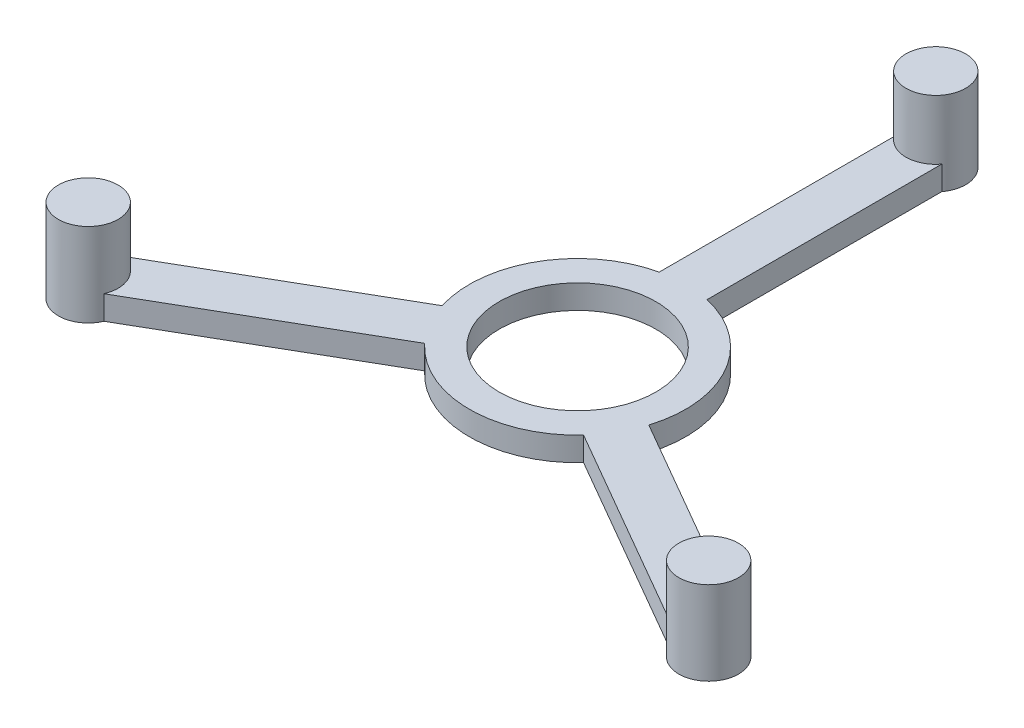
ISO-10303-21;
HEADER;
FILE_DESCRIPTION(('STEP AP214'),'2;1');
FILE_NAME('part.step','',(''),(''),'','','');
FILE_SCHEMA(('AUTOMOTIVE_DESIGN { 1 0 10303 214 1 1 1 1 }'));
ENDSEC;
DATA;
#1=APPLICATION_CONTEXT('core data for automotive mechanical design processes');
#2=APPLICATION_PROTOCOL_DEFINITION('international standard','automotive_design',2000,#1);
#3=PRODUCT_CONTEXT('',#1,'mechanical');
#4=PRODUCT('Part','Part','',(#3));
#5=PRODUCT_RELATED_PRODUCT_CATEGORY('part','',(#4));
#6=PRODUCT_DEFINITION_FORMATION('','',#4);
#7=PRODUCT_DEFINITION_CONTEXT('part definition',#1,'design');
#8=PRODUCT_DEFINITION('design','',#6,#7);
#9=PRODUCT_DEFINITION_SHAPE('','',#8);
#10=(LENGTH_UNIT() NAMED_UNIT(*) SI_UNIT(.MILLI.,.METRE.));
#11=(NAMED_UNIT(*) PLANE_ANGLE_UNIT() SI_UNIT($,.RADIAN.));
#12=(NAMED_UNIT(*) SI_UNIT($,.STERADIAN.) SOLID_ANGLE_UNIT());
#13=UNCERTAINTY_MEASURE_WITH_UNIT(LENGTH_MEASURE(1.E-05),#10,'distance_accuracy_value','');
#14=(GEOMETRIC_REPRESENTATION_CONTEXT(3) GLOBAL_UNCERTAINTY_ASSIGNED_CONTEXT((#13)) GLOBAL_UNIT_ASSIGNED_CONTEXT((#10,
#11,#12)) REPRESENTATION_CONTEXT('',''));
#15=CARTESIAN_POINT('',(0.,0.,0.));
#16=DIRECTION('',(0.,0.,1.));
#17=DIRECTION('',(1.,0.,0.));
#18=AXIS2_PLACEMENT_3D('',#15,#16,#17);
#19=CARTESIAN_POINT('',(0.,2.54,0.));
#20=DIRECTION('',(0.,1.,0.));
#21=DIRECTION('',(0.,0.,1.));
#22=AXIS2_PLACEMENT_3D('',#19,#20,#21);
#23=PLANE('',#22);
#24=CARTESIAN_POINT('',(0.,2.54,0.));
#25=DIRECTION('',(0.,1.,0.));
#26=DIRECTION('',(0.,0.,1.));
#27=AXIS2_PLACEMENT_3D('',#24,#25,#26);
#28=CIRCLE('',#27,8.334375);
#29=CARTESIAN_POINT('',(0.,2.54,8.334375));
#30=VERTEX_POINT('',#29);
#31=EDGE_CURVE('E193',#30,#30,#28,.T.);
#32=ORIENTED_EDGE('',*,*,#31,.F.);
#33=EDGE_LOOP('',(#32));
#34=FACE_BOUND('',#33,.T.);
#35=DIRECTION('',(0.866025403784443,0.,0.499999999999992));
#36=VECTOR('',#35,1.);
#37=CARTESIAN_POINT('',(8.45165544894336,2.54,7.81250491602859));
#38=LINE('',#37,#36);
#39=CARTESIAN_POINT('',(8.45165544894336,2.54,7.81250491602859));
#40=VERTEX_POINT('',#39);
#41=CARTESIAN_POINT('',(30.0757894899779,2.54,20.2972045256122));
#42=VERTEX_POINT('',#41);
#43=EDGE_CURVE('E134',#40,#42,#38,.T.);
#44=ORIENTED_EDGE('',*,*,#43,.T.);
#45=CARTESIAN_POINT('',(32.9955678841873,2.54,19.0499999999997));
#46=DIRECTION('',(0.,1.,0.));
#47=DIRECTION('',(-0.866025403784443,0.,-0.499999999999992));
#48=AXIS2_PLACEMENT_3D('',#45,#46,#47);
#49=CIRCLE('',#48,3.175);
#50=CARTESIAN_POINT('',(32.6157894899779,2.54,15.8977954743872));
#51=VERTEX_POINT('',#50);
#52=EDGE_CURVE('E141',#51,#42,#49,.T.);
#53=ORIENTED_EDGE('',*,*,#52,.F.);
#54=DIRECTION('',(-0.866025403784443,0.,-0.499999999999992));
#55=VECTOR('',#54,1.);
#56=CARTESIAN_POINT('',(10.9916554489433,2.54,3.41309586480362));
#57=LINE('',#56,#55);
#58=CARTESIAN_POINT('',(10.9916554489433,2.54,3.41309586480362));
#59=VERTEX_POINT('',#58);
#60=EDGE_CURVE('E125',#51,#59,#57,.T.);
#61=ORIENTED_EDGE('',*,*,#60,.T.);
#62=CARTESIAN_POINT('',(0.,2.54,0.));
#63=DIRECTION('',(0.,1.,0.));
#64=DIRECTION('',(0.,0.,1.));
#65=AXIS2_PLACEMENT_3D('',#62,#63,#64);
#66=CIRCLE('',#65,11.509375);
#67=CARTESIAN_POINT('',(2.54,2.54,-11.2256007808324));
#68=VERTEX_POINT('',#67);
#69=EDGE_CURVE('E203',#59,#68,#66,.T.);
#70=ORIENTED_EDGE('',*,*,#69,.T.);
#71=DIRECTION('',(0.,0.,-1.));
#72=VECTOR('',#71,1.);
#73=CARTESIAN_POINT('',(2.54,2.54,-11.2256007808324));
#74=LINE('',#73,#72);
#75=CARTESIAN_POINT('',(2.54,2.54,-36.195));
#76=VERTEX_POINT('',#75);
#77=EDGE_CURVE('E201',#68,#76,#74,.T.);
#78=ORIENTED_EDGE('',*,*,#77,.T.);
#79=CARTESIAN_POINT('',(0.,2.54,-38.1));
#80=DIRECTION('',(0.,1.,0.));
#81=DIRECTION('',(0.,0.,1.));
#82=AXIS2_PLACEMENT_3D('',#79,#80,#81);
#83=CIRCLE('',#82,3.175);
#84=CARTESIAN_POINT('',(-2.54,2.54,-36.195));
#85=VERTEX_POINT('',#84);
#86=EDGE_CURVE('E11',#85,#76,#83,.T.);
#87=ORIENTED_EDGE('',*,*,#86,.F.);
#88=DIRECTION('',(0.,0.,1.));
#89=VECTOR('',#88,1.);
#90=CARTESIAN_POINT('',(-2.54,2.54,-11.2256007808324));
#91=LINE('',#90,#89);
#92=CARTESIAN_POINT('',(-2.54,2.54,-11.2256007808324));
#93=VERTEX_POINT('',#92);
#94=EDGE_CURVE('E206',#85,#93,#91,.T.);
#95=ORIENTED_EDGE('',*,*,#94,.T.);
#96=CARTESIAN_POINT('',(-10.9916554489433,2.54,3.41309586480378));
#97=VERTEX_POINT('',#96);
#98=EDGE_CURVE('E199',#93,#97,#66,.T.);
#99=ORIENTED_EDGE('',*,*,#98,.T.);
#100=DIRECTION('',(-0.866025403784436,0.,0.500000000000004));
#101=VECTOR('',#100,1.);
#102=CARTESIAN_POINT('',(-10.9916554489433,2.54,3.41309586480378));
#103=LINE('',#102,#101);
#104=CARTESIAN_POINT('',(-32.6157894899777,2.54,15.8977954743877));
#105=VERTEX_POINT('',#104);
#106=EDGE_CURVE('E169',#97,#105,#103,.T.);
#107=ORIENTED_EDGE('',*,*,#106,.T.);
#108=CARTESIAN_POINT('',(-32.995567884187,2.54,19.0500000000002));
#109=DIRECTION('',(0.,1.,0.));
#110=DIRECTION('',(0.866025403784436,0.,-0.500000000000004));
#111=AXIS2_PLACEMENT_3D('',#108,#109,#110);
#112=CIRCLE('',#111,3.175);
#113=CARTESIAN_POINT('',(-30.0757894899777,2.54,20.2972045256126));
#114=VERTEX_POINT('',#113);
#115=EDGE_CURVE('E151',#114,#105,#112,.T.);
#116=ORIENTED_EDGE('',*,*,#115,.F.);
#117=DIRECTION('',(0.866025403784436,0.,-0.500000000000004));
#118=VECTOR('',#117,1.);
#119=CARTESIAN_POINT('',(-8.45165544894325,2.54,7.81250491602871));
#120=LINE('',#119,#118);
#121=CARTESIAN_POINT('',(-8.45165544894325,2.54,7.81250491602871));
#122=VERTEX_POINT('',#121);
#123=EDGE_CURVE('E171',#114,#122,#120,.T.);
#124=ORIENTED_EDGE('',*,*,#123,.T.);
#125=EDGE_CURVE('E202',#122,#40,#66,.T.);
#126=ORIENTED_EDGE('',*,*,#125,.T.);
#127=EDGE_LOOP('',(#44,#53,#61,#70,#78,#87,#95,#99,#107,#116,#124,#126));
#128=FACE_BOUND('',#127,.T.);
#129=ADVANCED_FACE('F33',(#34,#128),#23,.T.);
#130=CARTESIAN_POINT('',(0.,2.54,0.));
#131=DIRECTION('',(0.,-1.,0.));
#132=DIRECTION('',(0.,0.,-1.));
#133=AXIS2_PLACEMENT_3D('',#130,#131,#132);
#134=CYLINDRICAL_SURFACE('',#133,11.509375);
#135=DIRECTION('',(0.,-1.,0.));
#136=VECTOR('',#135,1.);
#137=CARTESIAN_POINT('',(-10.9916554489433,2.54,3.41309586480378));
#138=LINE('',#137,#136);
#139=CARTESIAN_POINT('',(-10.9916554489433,0.,3.41309586480378));
#140=VERTEX_POINT('',#139);
#141=EDGE_CURVE('E57',#97,#140,#138,.T.);
#142=ORIENTED_EDGE('',*,*,#141,.F.);
#143=ORIENTED_EDGE('',*,*,#98,.F.);
#144=DIRECTION('',(0.,-1.,0.));
#145=VECTOR('',#144,1.);
#146=CARTESIAN_POINT('',(-2.54,2.54,-11.2256007808324));
#147=LINE('',#146,#145);
#148=CARTESIAN_POINT('',(-2.54,0.,-11.2256007808324));
#149=VERTEX_POINT('',#148);
#150=EDGE_CURVE('E208',#93,#149,#147,.T.);
#151=ORIENTED_EDGE('',*,*,#150,.T.);
#152=CARTESIAN_POINT('',(0.,0.,0.));
#153=DIRECTION('',(0.,1.,0.));
#154=DIRECTION('',(0.,0.,1.));
#155=AXIS2_PLACEMENT_3D('',#152,#153,#154);
#156=CIRCLE('',#155,11.509375);
#157=EDGE_CURVE('E209',#149,#140,#156,.T.);
#158=ORIENTED_EDGE('',*,*,#157,.T.);
#159=EDGE_LOOP('',(#142,#143,#151,#158));
#160=FACE_BOUND('',#159,.T.);
#161=ADVANCED_FACE('F35',(#160),#134,.T.);
#162=DIRECTION('',(0.,-1.,0.));
#163=VECTOR('',#162,1.);
#164=CARTESIAN_POINT('',(-8.45165544894325,2.54,7.81250491602871));
#165=LINE('',#164,#163);
#166=CARTESIAN_POINT('',(-8.45165544894325,0.,7.81250491602871));
#167=VERTEX_POINT('',#166);
#168=EDGE_CURVE('E175',#122,#167,#165,.T.);
#169=ORIENTED_EDGE('',*,*,#168,.T.);
#170=CARTESIAN_POINT('',(8.45165544894336,0.,7.81250491602859));
#171=VERTEX_POINT('',#170);
#172=EDGE_CURVE('E212',#167,#171,#156,.T.);
#173=ORIENTED_EDGE('',*,*,#172,.T.);
#174=DIRECTION('',(0.,-1.,0.));
#175=VECTOR('',#174,1.);
#176=CARTESIAN_POINT('',(8.45165544894336,2.54,7.81250491602859));
#177=LINE('',#176,#175);
#178=EDGE_CURVE('E49',#40,#171,#177,.T.);
#179=ORIENTED_EDGE('',*,*,#178,.F.);
#180=ORIENTED_EDGE('',*,*,#125,.F.);
#181=EDGE_LOOP('',(#169,#173,#179,#180));
#182=FACE_BOUND('',#181,.T.);
#183=ADVANCED_FACE('F267',(#182),#134,.T.);
#184=DIRECTION('',(0.,-1.,0.));
#185=VECTOR('',#184,1.);
#186=CARTESIAN_POINT('',(10.9916554489433,2.54,3.41309586480362));
#187=LINE('',#186,#185);
#188=CARTESIAN_POINT('',(10.9916554489433,0.,3.41309586480362));
#189=VERTEX_POINT('',#188);
#190=EDGE_CURVE('E131',#59,#189,#187,.T.);
#191=ORIENTED_EDGE('',*,*,#190,.T.);
#192=CARTESIAN_POINT('',(2.54,0.,-11.2256007808324));
#193=VERTEX_POINT('',#192);
#194=EDGE_CURVE('E196',#189,#193,#156,.T.);
#195=ORIENTED_EDGE('',*,*,#194,.T.);
#196=DIRECTION('',(0.,-1.,0.));
#197=VECTOR('',#196,1.);
#198=CARTESIAN_POINT('',(2.54,2.54,-11.2256007808324));
#199=LINE('',#198,#197);
#200=EDGE_CURVE('E37',#68,#193,#199,.T.);
#201=ORIENTED_EDGE('',*,*,#200,.F.);
#202=ORIENTED_EDGE('',*,*,#69,.F.);
#203=EDGE_LOOP('',(#191,#195,#201,#202));
#204=FACE_BOUND('',#203,.T.);
#205=ADVANCED_FACE('F233',(#204),#134,.T.);
#206=CARTESIAN_POINT('',(0.,0.,0.));
#207=DIRECTION('',(0.,1.,0.));
#208=DIRECTION('',(0.,0.,1.));
#209=AXIS2_PLACEMENT_3D('',#206,#207,#208);
#210=PLANE('',#209);
#211=ORIENTED_EDGE('',*,*,#157,.F.);
#212=DIRECTION('',(0.,0.,1.));
#213=VECTOR('',#212,1.);
#214=CARTESIAN_POINT('',(-2.54,0.,-11.2256007808324));
#215=LINE('',#214,#213);
#216=CARTESIAN_POINT('',(-2.54,0.,-36.195));
#217=VERTEX_POINT('',#216);
#218=EDGE_CURVE('E216',#217,#149,#215,.T.);
#219=ORIENTED_EDGE('',*,*,#218,.F.);
#220=CARTESIAN_POINT('',(0.,0.,-38.1));
#221=DIRECTION('',(0.,1.,0.));
#222=DIRECTION('',(0.,0.,1.));
#223=AXIS2_PLACEMENT_3D('',#220,#221,#222);
#224=CIRCLE('',#223,3.175);
#225=CARTESIAN_POINT('',(2.54,0.,-36.195));
#226=VERTEX_POINT('',#225);
#227=EDGE_CURVE('E214',#226,#217,#224,.T.);
#228=ORIENTED_EDGE('',*,*,#227,.F.);
#229=DIRECTION('',(0.,0.,-1.));
#230=VECTOR('',#229,1.);
#231=CARTESIAN_POINT('',(2.54,0.,-11.2256007808324));
#232=LINE('',#231,#230);
#233=EDGE_CURVE('E211',#193,#226,#232,.T.);
#234=ORIENTED_EDGE('',*,*,#233,.F.);
#235=ORIENTED_EDGE('',*,*,#194,.F.);
#236=DIRECTION('',(-0.866025403784443,0.,-0.499999999999992));
#237=VECTOR('',#236,1.);
#238=CARTESIAN_POINT('',(10.9916554489433,0.,3.41309586480362));
#239=LINE('',#238,#237);
#240=CARTESIAN_POINT('',(32.6157894899779,0.,15.8977954743872));
#241=VERTEX_POINT('',#240);
#242=EDGE_CURVE('E160',#241,#189,#239,.T.);
#243=ORIENTED_EDGE('',*,*,#242,.F.);
#244=CARTESIAN_POINT('',(32.9955678841873,0.,19.0499999999997));
#245=DIRECTION('',(0.,1.,0.));
#246=DIRECTION('',(-0.866025403784443,0.,-0.499999999999992));
#247=AXIS2_PLACEMENT_3D('',#244,#245,#246);
#248=CIRCLE('',#247,3.175);
#249=CARTESIAN_POINT('',(30.0757894899779,0.,20.2972045256122));
#250=VERTEX_POINT('',#249);
#251=EDGE_CURVE('E143',#250,#241,#248,.T.);
#252=ORIENTED_EDGE('',*,*,#251,.F.);
#253=DIRECTION('',(0.866025403784443,0.,0.499999999999992));
#254=VECTOR('',#253,1.);
#255=CARTESIAN_POINT('',(8.45165544894336,0.,7.81250491602859));
#256=LINE('',#255,#254);
#257=EDGE_CURVE('E157',#171,#250,#256,.T.);
#258=ORIENTED_EDGE('',*,*,#257,.F.);
#259=ORIENTED_EDGE('',*,*,#172,.F.);
#260=DIRECTION('',(0.866025403784436,0.,-0.500000000000004));
#261=VECTOR('',#260,1.);
#262=CARTESIAN_POINT('',(-8.45165544894325,0.,7.81250491602871));
#263=LINE('',#262,#261);
#264=CARTESIAN_POINT('',(-30.0757894899777,0.,20.2972045256126));
#265=VERTEX_POINT('',#264);
#266=EDGE_CURVE('E172',#265,#167,#263,.T.);
#267=ORIENTED_EDGE('',*,*,#266,.F.);
#268=CARTESIAN_POINT('',(-32.995567884187,0.,19.0500000000002));
#269=DIRECTION('',(0.,1.,0.));
#270=DIRECTION('',(0.866025403784436,0.,-0.500000000000004));
#271=AXIS2_PLACEMENT_3D('',#268,#269,#270);
#272=CIRCLE('',#271,3.175);
#273=CARTESIAN_POINT('',(-32.6157894899777,0.,15.8977954743877));
#274=VERTEX_POINT('',#273);
#275=EDGE_CURVE('E177',#274,#265,#272,.T.);
#276=ORIENTED_EDGE('',*,*,#275,.F.);
#277=DIRECTION('',(-0.866025403784436,0.,0.500000000000004));
#278=VECTOR('',#277,1.);
#279=CARTESIAN_POINT('',(-10.9916554489433,0.,3.41309586480378));
#280=LINE('',#279,#278);
#281=EDGE_CURVE('E168',#140,#274,#280,.T.);
#282=ORIENTED_EDGE('',*,*,#281,.F.);
#283=EDGE_LOOP('',(#211,#219,#228,#234,#235,#243,#252,#258,#259,#267,#276,#282));
#284=FACE_BOUND('',#283,.T.);
#285=CARTESIAN_POINT('',(0.,0.,0.));
#286=DIRECTION('',(0.,1.,0.));
#287=DIRECTION('',(0.,0.,1.));
#288=AXIS2_PLACEMENT_3D('',#285,#286,#287);
#289=CIRCLE('',#288,8.334375);
#290=CARTESIAN_POINT('',(0.,0.,8.334375));
#291=VERTEX_POINT('',#290);
#292=EDGE_CURVE('E191',#291,#291,#289,.T.);
#293=ORIENTED_EDGE('',*,*,#292,.T.);
#294=EDGE_LOOP('',(#293));
#295=FACE_BOUND('',#294,.T.);
#296=ADVANCED_FACE('F237',(#284,#295),#210,.F.);
#297=CARTESIAN_POINT('',(2.54,2.54,-11.2256007808324));
#298=DIRECTION('',(-1.,0.,0.));
#299=DIRECTION('',(0.,0.,1.));
#300=AXIS2_PLACEMENT_3D('',#297,#298,#299);
#301=PLANE('',#300);
#302=ORIENTED_EDGE('',*,*,#233,.T.);
#303=DIRECTION('',(0.,-1.,0.));
#304=VECTOR('',#303,1.);
#305=CARTESIAN_POINT('',(2.54,2.54,-36.195));
#306=LINE('',#305,#304);
#307=EDGE_CURVE('E222',#76,#226,#306,.T.);
#308=ORIENTED_EDGE('',*,*,#307,.F.);
#309=ORIENTED_EDGE('',*,*,#77,.F.);
#310=ORIENTED_EDGE('',*,*,#200,.T.);
#311=EDGE_LOOP('',(#302,#308,#309,#310));
#312=FACE_BOUND('',#311,.T.);
#313=ADVANCED_FACE('F230',(#312),#301,.F.);
#314=CARTESIAN_POINT('',(0.,2.54,-38.1));
#315=DIRECTION('',(0.,-1.,0.));
#316=DIRECTION('',(0.,0.,-1.));
#317=AXIS2_PLACEMENT_3D('',#314,#315,#316);
#318=CYLINDRICAL_SURFACE('',#317,3.175);
#319=ORIENTED_EDGE('',*,*,#227,.T.);
#320=DIRECTION('',(0.,-1.,0.));
#321=VECTOR('',#320,1.);
#322=CARTESIAN_POINT('',(-2.54,2.54,-36.195));
#323=LINE('',#322,#321);
#324=EDGE_CURVE('E220',#85,#217,#323,.T.);
#325=ORIENTED_EDGE('',*,*,#324,.F.);
#326=ORIENTED_EDGE('',*,*,#86,.T.);
#327=ORIENTED_EDGE('',*,*,#307,.T.);
#328=EDGE_LOOP('',(#319,#325,#326,#327));
#329=FACE_BOUND('',#328,.T.);
#330=CARTESIAN_POINT('',(0.,8.89,-38.1));
#331=DIRECTION('',(0.,1.,0.));
#332=DIRECTION('',(0.,0.,1.));
#333=AXIS2_PLACEMENT_3D('',#330,#331,#332);
#334=CIRCLE('',#333,3.175);
#335=CARTESIAN_POINT('',(0.,8.89,-34.925));
#336=VERTEX_POINT('',#335);
#337=EDGE_CURVE('E189',#336,#336,#334,.T.);
#338=ORIENTED_EDGE('',*,*,#337,.F.);
#339=EDGE_LOOP('',(#338));
#340=FACE_BOUND('',#339,.T.);
#341=ADVANCED_FACE('F241',(#329,#340),#318,.T.);
#342=CARTESIAN_POINT('',(-2.54,2.54,-11.2256007808324));
#343=DIRECTION('',(1.,0.,0.));
#344=DIRECTION('',(0.,0.,-1.));
#345=AXIS2_PLACEMENT_3D('',#342,#343,#344);
#346=PLANE('',#345);
#347=ORIENTED_EDGE('',*,*,#218,.T.);
#348=ORIENTED_EDGE('',*,*,#150,.F.);
#349=ORIENTED_EDGE('',*,*,#94,.F.);
#350=ORIENTED_EDGE('',*,*,#324,.T.);
#351=EDGE_LOOP('',(#347,#348,#349,#350));
#352=FACE_BOUND('',#351,.T.);
#353=ADVANCED_FACE('F245',(#352),#346,.F.);
#354=CARTESIAN_POINT('',(0.,2.54,0.));
#355=DIRECTION('',(0.,-1.,0.));
#356=DIRECTION('',(0.,0.,-1.));
#357=AXIS2_PLACEMENT_3D('',#354,#355,#356);
#358=CYLINDRICAL_SURFACE('',#357,8.334375);
#359=ORIENTED_EDGE('',*,*,#31,.T.);
#360=EDGE_LOOP('',(#359));
#361=FACE_BOUND('',#360,.T.);
#362=ORIENTED_EDGE('',*,*,#292,.F.);
#363=EDGE_LOOP('',(#362));
#364=FACE_BOUND('',#363,.T.);
#365=ADVANCED_FACE('F286',(#361,#364),#358,.F.);
#366=CARTESIAN_POINT('',(0.,8.89,-38.1));
#367=DIRECTION('',(0.,1.,0.));
#368=DIRECTION('',(0.,0.,1.));
#369=AXIS2_PLACEMENT_3D('',#366,#367,#368);
#370=PLANE('',#369);
#371=ORIENTED_EDGE('',*,*,#337,.T.);
#372=EDGE_LOOP('',(#371));
#373=FACE_BOUND('',#372,.T.);
#374=ADVANCED_FACE('F303',(#373),#370,.T.);
#375=CARTESIAN_POINT('',(32.9955678841873,2.54,19.0499999999997));
#376=DIRECTION('',(0.,-1.,0.));
#377=DIRECTION('',(0.,0.,-1.));
#378=AXIS2_PLACEMENT_3D('',#375,#376,#377);
#379=CYLINDRICAL_SURFACE('',#378,3.175);
#380=ORIENTED_EDGE('',*,*,#251,.T.);
#381=DIRECTION('',(0.,-1.,0.));
#382=VECTOR('',#381,1.);
#383=CARTESIAN_POINT('',(32.6157894899779,2.54,15.8977954743872));
#384=LINE('',#383,#382);
#385=EDGE_CURVE('E129',#51,#241,#384,.T.);
#386=ORIENTED_EDGE('',*,*,#385,.F.);
#387=ORIENTED_EDGE('',*,*,#52,.T.);
#388=DIRECTION('',(0.,-1.,0.));
#389=VECTOR('',#388,1.);
#390=CARTESIAN_POINT('',(30.0757894899779,2.54,20.2972045256122));
#391=LINE('',#390,#389);
#392=EDGE_CURVE('E144',#42,#250,#391,.T.);
#393=ORIENTED_EDGE('',*,*,#392,.T.);
#394=EDGE_LOOP('',(#380,#386,#387,#393));
#395=FACE_BOUND('',#394,.T.);
#396=CARTESIAN_POINT('',(32.9955678841873,8.89,19.0499999999997));
#397=DIRECTION('',(0.,1.,0.));
#398=DIRECTION('',(-0.866025403784443,0.,-0.499999999999992));
#399=AXIS2_PLACEMENT_3D('',#396,#397,#398);
#400=CIRCLE('',#399,3.175);
#401=CARTESIAN_POINT('',(30.2459372271717,8.89,17.4624999999997));
#402=VERTEX_POINT('',#401);
#403=EDGE_CURVE('E148',#402,#402,#400,.T.);
#404=ORIENTED_EDGE('',*,*,#403,.F.);
#405=EDGE_LOOP('',(#404));
#406=FACE_BOUND('',#405,.T.);
#407=ADVANCED_FACE('F138',(#395,#406),#379,.T.);
#408=CARTESIAN_POINT('',(10.9916554489433,2.54,3.41309586480362));
#409=DIRECTION('',(-0.499999999999992,0.,0.866025403784443));
#410=DIRECTION('',(0.866025403784443,0.,0.499999999999992));
#411=AXIS2_PLACEMENT_3D('',#408,#409,#410);
#412=PLANE('',#411);
#413=ORIENTED_EDGE('',*,*,#242,.T.);
#414=ORIENTED_EDGE('',*,*,#190,.F.);
#415=ORIENTED_EDGE('',*,*,#60,.F.);
#416=ORIENTED_EDGE('',*,*,#385,.T.);
#417=EDGE_LOOP('',(#413,#414,#415,#416));
#418=FACE_BOUND('',#417,.T.);
#419=ADVANCED_FACE('F128',(#418),#412,.F.);
#420=CARTESIAN_POINT('',(8.45165544894336,2.54,7.81250491602859));
#421=DIRECTION('',(0.499999999999992,0.,-0.866025403784443));
#422=DIRECTION('',(-0.866025403784443,0.,-0.499999999999992));
#423=AXIS2_PLACEMENT_3D('',#420,#421,#422);
#424=PLANE('',#423);
#425=ORIENTED_EDGE('',*,*,#257,.T.);
#426=ORIENTED_EDGE('',*,*,#392,.F.);
#427=ORIENTED_EDGE('',*,*,#43,.F.);
#428=ORIENTED_EDGE('',*,*,#178,.T.);
#429=EDGE_LOOP('',(#425,#426,#427,#428));
#430=FACE_BOUND('',#429,.T.);
#431=ADVANCED_FACE('F251',(#430),#424,.F.);
#432=CARTESIAN_POINT('',(-10.9916554489433,2.54,3.41309586480378));
#433=DIRECTION('',(0.500000000000004,0.,0.866025403784436));
#434=DIRECTION('',(0.866025403784436,0.,-0.500000000000004));
#435=AXIS2_PLACEMENT_3D('',#432,#433,#434);
#436=PLANE('',#435);
#437=ORIENTED_EDGE('',*,*,#281,.T.);
#438=DIRECTION('',(0.,-1.,0.));
#439=VECTOR('',#438,1.);
#440=CARTESIAN_POINT('',(-32.6157894899777,2.54,15.8977954743877));
#441=LINE('',#440,#439);
#442=EDGE_CURVE('E185',#105,#274,#441,.T.);
#443=ORIENTED_EDGE('',*,*,#442,.F.);
#444=ORIENTED_EDGE('',*,*,#106,.F.);
#445=ORIENTED_EDGE('',*,*,#141,.T.);
#446=EDGE_LOOP('',(#437,#443,#444,#445));
#447=FACE_BOUND('',#446,.T.);
#448=ADVANCED_FACE('F264',(#447),#436,.F.);
#449=CARTESIAN_POINT('',(-32.995567884187,2.54,19.0500000000002));
#450=DIRECTION('',(0.,-1.,0.));
#451=DIRECTION('',(0.,0.,-1.));
#452=AXIS2_PLACEMENT_3D('',#449,#450,#451);
#453=CYLINDRICAL_SURFACE('',#452,3.175);
#454=ORIENTED_EDGE('',*,*,#275,.T.);
#455=DIRECTION('',(0.,-1.,0.));
#456=VECTOR('',#455,1.);
#457=CARTESIAN_POINT('',(-30.0757894899777,2.54,20.2972045256126));
#458=LINE('',#457,#456);
#459=EDGE_CURVE('E182',#114,#265,#458,.T.);
#460=ORIENTED_EDGE('',*,*,#459,.F.);
#461=ORIENTED_EDGE('',*,*,#115,.T.);
#462=ORIENTED_EDGE('',*,*,#442,.T.);
#463=EDGE_LOOP('',(#454,#460,#461,#462));
#464=FACE_BOUND('',#463,.T.);
#465=CARTESIAN_POINT('',(-32.995567884187,8.89,19.0500000000002));
#466=DIRECTION('',(0.,1.,0.));
#467=DIRECTION('',(0.866025403784436,0.,-0.500000000000004));
#468=AXIS2_PLACEMENT_3D('',#465,#466,#467);
#469=CIRCLE('',#468,3.175);
#470=CARTESIAN_POINT('',(-30.2459372271714,8.89,17.4625000000001));
#471=VERTEX_POINT('',#470);
#472=EDGE_CURVE('E154',#471,#471,#469,.T.);
#473=ORIENTED_EDGE('',*,*,#472,.F.);
#474=EDGE_LOOP('',(#473));
#475=FACE_BOUND('',#474,.T.);
#476=ADVANCED_FACE('F260',(#464,#475),#453,.T.);
#477=CARTESIAN_POINT('',(-8.45165544894325,2.54,7.81250491602871));
#478=DIRECTION('',(-0.500000000000004,0.,-0.866025403784436));
#479=DIRECTION('',(-0.866025403784436,0.,0.500000000000004));
#480=AXIS2_PLACEMENT_3D('',#477,#478,#479);
#481=PLANE('',#480);
#482=ORIENTED_EDGE('',*,*,#266,.T.);
#483=ORIENTED_EDGE('',*,*,#168,.F.);
#484=ORIENTED_EDGE('',*,*,#123,.F.);
#485=ORIENTED_EDGE('',*,*,#459,.T.);
#486=EDGE_LOOP('',(#482,#483,#484,#485));
#487=FACE_BOUND('',#486,.T.);
#488=ADVANCED_FACE('F257',(#487),#481,.F.);
#489=CARTESIAN_POINT('',(-32.995567884187,8.89,19.0500000000002));
#490=DIRECTION('',(0.,1.,0.));
#491=DIRECTION('',(0.866025403784436,0.,-0.500000000000004));
#492=AXIS2_PLACEMENT_3D('',#489,#490,#491);
#493=PLANE('',#492);
#494=ORIENTED_EDGE('',*,*,#472,.T.);
#495=EDGE_LOOP('',(#494));
#496=FACE_BOUND('',#495,.T.);
#497=ADVANCED_FACE('F347',(#496),#493,.T.);
#498=CARTESIAN_POINT('',(32.9955678841873,8.89,19.0499999999997));
#499=DIRECTION('',(0.,1.,0.));
#500=DIRECTION('',(-0.866025403784443,0.,-0.499999999999992));
#501=AXIS2_PLACEMENT_3D('',#498,#499,#500);
#502=PLANE('',#501);
#503=ORIENTED_EDGE('',*,*,#403,.T.);
#504=EDGE_LOOP('',(#503));
#505=FACE_BOUND('',#504,.T.);
#506=ADVANCED_FACE('F354',(#505),#502,.T.);
#507=CLOSED_SHELL('',(#129,#161,#183,#205,#296,#313,#341,#353,#365,#374,#407,#419,#431,#448,
#476,#488,#497,#506));
#508=MANIFOLD_SOLID_BREP('B2',#507);
#509=ADVANCED_BREP_SHAPE_REPRESENTATION('',(#18,#508),#14);
#510=SHAPE_DEFINITION_REPRESENTATION(#9,#509);
ENDSEC;
END-ISO-10303-21;
